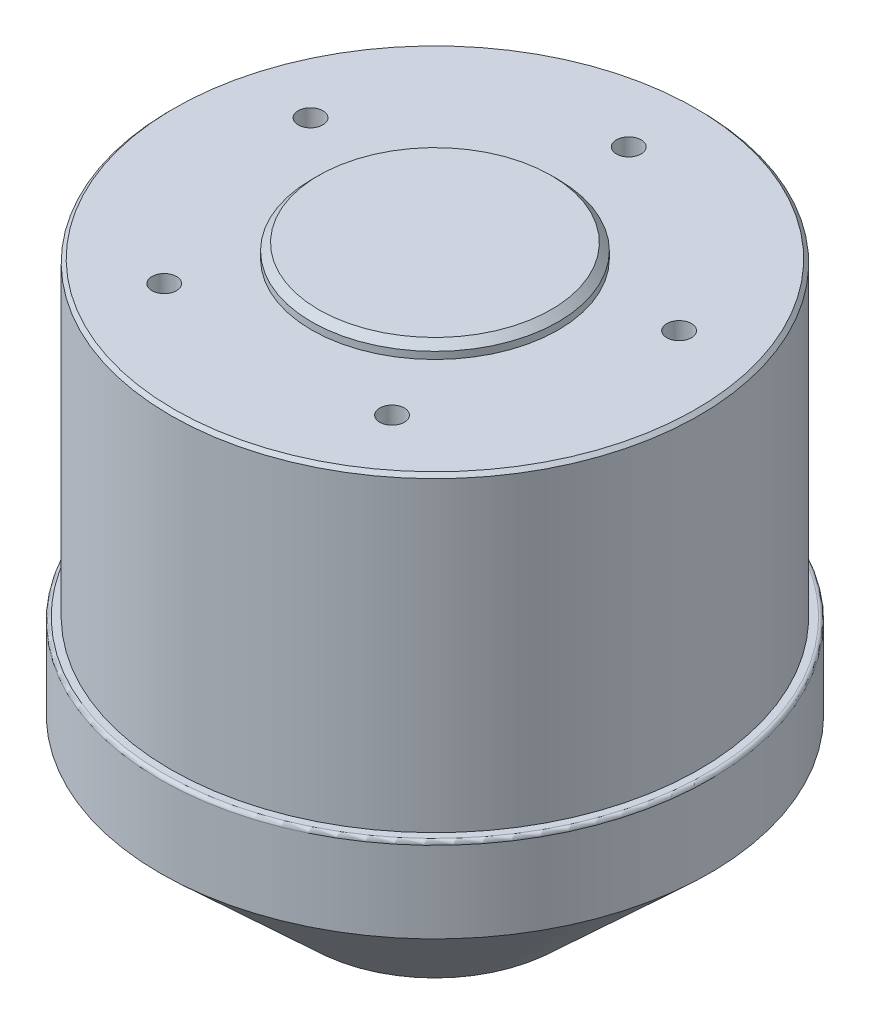
ISO-10303-21;
HEADER;
FILE_DESCRIPTION(('STEP AP214'),'2;1');
FILE_NAME('part.step','',(''),(''),'','','');
FILE_SCHEMA(('AUTOMOTIVE_DESIGN { 1 0 10303 214 1 1 1 1 }'));
ENDSEC;
DATA;
#1=APPLICATION_CONTEXT('core data for automotive mechanical design processes');
#2=APPLICATION_PROTOCOL_DEFINITION('international standard','automotive_design',2000,#1);
#3=PRODUCT_CONTEXT('',#1,'mechanical');
#4=PRODUCT('Part','Part','',(#3));
#5=PRODUCT_RELATED_PRODUCT_CATEGORY('part','',(#4));
#6=PRODUCT_DEFINITION_FORMATION('','',#4);
#7=PRODUCT_DEFINITION_CONTEXT('part definition',#1,'design');
#8=PRODUCT_DEFINITION('design','',#6,#7);
#9=PRODUCT_DEFINITION_SHAPE('','',#8);
#10=(LENGTH_UNIT() NAMED_UNIT(*) SI_UNIT(.MILLI.,.METRE.));
#11=(NAMED_UNIT(*) PLANE_ANGLE_UNIT() SI_UNIT($,.RADIAN.));
#12=(NAMED_UNIT(*) SI_UNIT($,.STERADIAN.) SOLID_ANGLE_UNIT());
#13=UNCERTAINTY_MEASURE_WITH_UNIT(LENGTH_MEASURE(1.E-05),#10,'distance_accuracy_value','');
#14=(GEOMETRIC_REPRESENTATION_CONTEXT(3) GLOBAL_UNCERTAINTY_ASSIGNED_CONTEXT((#13)) GLOBAL_UNIT_ASSIGNED_CONTEXT((#10,
#11,#12)) REPRESENTATION_CONTEXT('',''));
#15=CARTESIAN_POINT('',(0.,0.,0.));
#16=DIRECTION('',(0.,0.,1.));
#17=DIRECTION('',(1.,0.,0.));
#18=AXIS2_PLACEMENT_3D('',#15,#16,#17);
#19=CARTESIAN_POINT('',(0.,76.,0.));
#20=DIRECTION('',(0.,-1.,0.));
#21=DIRECTION('',(0.,0.,-1.));
#22=AXIS2_PLACEMENT_3D('',#19,#20,#21);
#23=CYLINDRICAL_SURFACE('',#22,37.5);
#24=CARTESIAN_POINT('',(0.,75.5,0.));
#25=DIRECTION('',(0.,1.,0.));
#26=DIRECTION('',(0.,0.,1.));
#27=AXIS2_PLACEMENT_3D('',#24,#25,#26);
#28=CIRCLE('',#27,37.5);
#29=CARTESIAN_POINT('',(0.,75.5,37.5));
#30=VERTEX_POINT('',#29);
#31=EDGE_CURVE('E78',#30,#30,#28,.F.);
#32=ORIENTED_EDGE('',*,*,#31,.T.);
#33=EDGE_LOOP('',(#32));
#34=FACE_BOUND('',#33,.T.);
#35=CARTESIAN_POINT('',(0.,32.,0.));
#36=DIRECTION('',(0.,1.,0.));
#37=DIRECTION('',(0.,0.,1.));
#38=AXIS2_PLACEMENT_3D('',#35,#36,#37);
#39=CIRCLE('',#38,37.5);
#40=CARTESIAN_POINT('',(0.,32.,37.5));
#41=VERTEX_POINT('',#40);
#42=EDGE_CURVE('E98',#41,#41,#39,.T.);
#43=ORIENTED_EDGE('',*,*,#42,.T.);
#44=EDGE_LOOP('',(#43));
#45=FACE_BOUND('',#44,.T.);
#46=ADVANCED_FACE('F53',(#34,#45),#23,.T.);
#47=CARTESIAN_POINT('',(0.,76.,0.));
#48=DIRECTION('',(0.,1.,0.));
#49=DIRECTION('',(0.,0.,1.));
#50=AXIS2_PLACEMENT_3D('',#47,#48,#49);
#51=PLANE('',#50);
#52=CARTESIAN_POINT('',(0.,76.,0.));
#53=DIRECTION('',(0.,1.,0.));
#54=DIRECTION('',(0.,0.,1.));
#55=AXIS2_PLACEMENT_3D('',#52,#53,#54);
#56=CIRCLE('',#55,37.);
#57=CARTESIAN_POINT('',(0.,76.,37.));
#58=VERTEX_POINT('',#57);
#59=EDGE_CURVE('E82',#58,#58,#56,.T.);
#60=ORIENTED_EDGE('',*,*,#59,.T.);
#61=EDGE_LOOP('',(#60));
#62=FACE_BOUND('',#61,.T.);
#63=CARTESIAN_POINT('',(0.,76.,-27.5));
#64=DIRECTION('',(0.,1.,0.));
#65=DIRECTION('',(0.,0.,1.));
#66=AXIS2_PLACEMENT_3D('',#63,#64,#65);
#67=CIRCLE('',#66,1.75);
#68=CARTESIAN_POINT('',(0.,76.,-25.75));
#69=VERTEX_POINT('',#68);
#70=EDGE_CURVE('E136',#69,#69,#67,.T.);
#71=ORIENTED_EDGE('',*,*,#70,.F.);
#72=EDGE_LOOP('',(#71));
#73=FACE_BOUND('',#72,.T.);
#74=CARTESIAN_POINT('',(26.1540541981167,76.,-8.49796734531098));
#75=DIRECTION('',(0.,1.,0.));
#76=DIRECTION('',(0.,0.,1.));
#77=AXIS2_PLACEMENT_3D('',#74,#75,#76);
#78=CIRCLE('',#77,1.75);
#79=CARTESIAN_POINT('',(26.1540541981167,76.,-6.74796734531098));
#80=VERTEX_POINT('',#79);
#81=EDGE_CURVE('E132',#80,#80,#78,.T.);
#82=ORIENTED_EDGE('',*,*,#81,.F.);
#83=EDGE_LOOP('',(#82));
#84=FACE_BOUND('',#83,.T.);
#85=CARTESIAN_POINT('',(16.1640944380429,76.,22.2479673453112));
#86=DIRECTION('',(0.,1.,0.));
#87=DIRECTION('',(0.,0.,1.));
#88=AXIS2_PLACEMENT_3D('',#85,#86,#87);
#89=CIRCLE('',#88,1.75);
#90=CARTESIAN_POINT('',(16.1640944380429,76.,23.9979673453112));
#91=VERTEX_POINT('',#90);
#92=EDGE_CURVE('E124',#91,#91,#89,.T.);
#93=ORIENTED_EDGE('',*,*,#92,.F.);
#94=EDGE_LOOP('',(#93));
#95=FACE_BOUND('',#94,.T.);
#96=CARTESIAN_POINT('',(-16.1640944380432,76.,22.2479673453109));
#97=DIRECTION('',(0.,1.,0.));
#98=DIRECTION('',(0.,0.,1.));
#99=AXIS2_PLACEMENT_3D('',#96,#97,#98);
#100=CIRCLE('',#99,1.75);
#101=CARTESIAN_POINT('',(-16.1640944380432,76.,23.9979673453109));
#102=VERTEX_POINT('',#101);
#103=EDGE_CURVE('E116',#102,#102,#100,.T.);
#104=ORIENTED_EDGE('',*,*,#103,.F.);
#105=EDGE_LOOP('',(#104));
#106=FACE_BOUND('',#105,.T.);
#107=CARTESIAN_POINT('',(-26.1540541981166,76.,-8.49796734531135));
#108=DIRECTION('',(0.,1.,0.));
#109=DIRECTION('',(0.,0.,1.));
#110=AXIS2_PLACEMENT_3D('',#107,#108,#109);
#111=CIRCLE('',#110,1.75);
#112=CARTESIAN_POINT('',(-26.1540541981166,76.,-6.74796734531135));
#113=VERTEX_POINT('',#112);
#114=EDGE_CURVE('E107',#113,#113,#111,.T.);
#115=ORIENTED_EDGE('',*,*,#114,.F.);
#116=EDGE_LOOP('',(#115));
#117=FACE_BOUND('',#116,.T.);
#118=CARTESIAN_POINT('',(0.,76.,0.));
#119=DIRECTION('',(0.,1.,0.));
#120=DIRECTION('',(0.,0.,1.));
#121=AXIS2_PLACEMENT_3D('',#118,#119,#120);
#122=CIRCLE('',#121,17.5);
#123=CARTESIAN_POINT('',(0.,76.,17.5));
#124=VERTEX_POINT('',#123);
#125=EDGE_CURVE('E94',#124,#124,#122,.T.);
#126=ORIENTED_EDGE('',*,*,#125,.F.);
#127=EDGE_LOOP('',(#126));
#128=FACE_BOUND('',#127,.T.);
#129=ADVANCED_FACE('F188',(#62,#73,#84,#95,#106,#117,#128),#51,.T.);
#130=CARTESIAN_POINT('',(0.,78.,0.));
#131=DIRECTION('',(0.,-1.,0.));
#132=DIRECTION('',(0.,0.,-1.));
#133=AXIS2_PLACEMENT_3D('',#130,#131,#132);
#134=CYLINDRICAL_SURFACE('',#133,17.5);
#135=CARTESIAN_POINT('',(0.,77.,0.));
#136=DIRECTION('',(0.,1.,0.));
#137=DIRECTION('',(0.,0.,1.));
#138=AXIS2_PLACEMENT_3D('',#135,#136,#137);
#139=CIRCLE('',#138,17.5);
#140=CARTESIAN_POINT('',(0.,77.,17.5));
#141=VERTEX_POINT('',#140);
#142=EDGE_CURVE('E11',#141,#141,#139,.F.);
#143=ORIENTED_EDGE('',*,*,#142,.T.);
#144=EDGE_LOOP('',(#143));
#145=FACE_BOUND('',#144,.T.);
#146=ORIENTED_EDGE('',*,*,#125,.T.);
#147=EDGE_LOOP('',(#146));
#148=FACE_BOUND('',#147,.T.);
#149=ADVANCED_FACE('F194',(#145,#148),#134,.T.);
#150=CARTESIAN_POINT('',(0.,78.,0.));
#151=DIRECTION('',(0.,1.,0.));
#152=DIRECTION('',(0.,0.,1.));
#153=AXIS2_PLACEMENT_3D('',#150,#151,#152);
#154=PLANE('',#153);
#155=CARTESIAN_POINT('',(0.,78.,0.));
#156=DIRECTION('',(0.,1.,0.));
#157=DIRECTION('',(0.,0.,1.));
#158=AXIS2_PLACEMENT_3D('',#155,#156,#157);
#159=CIRCLE('',#158,16.5);
#160=CARTESIAN_POINT('',(0.,78.,16.5));
#161=VERTEX_POINT('',#160);
#162=EDGE_CURVE('E62',#161,#161,#159,.T.);
#163=ORIENTED_EDGE('',*,*,#162,.T.);
#164=EDGE_LOOP('',(#163));
#165=FACE_BOUND('',#164,.T.);
#166=ADVANCED_FACE('F171',(#165),#154,.T.);
#167=CARTESIAN_POINT('',(0.,32.,0.));
#168=DIRECTION('',(0.,-1.,0.));
#169=DIRECTION('',(0.,0.,-1.));
#170=AXIS2_PLACEMENT_3D('',#167,#168,#169);
#171=CYLINDRICAL_SURFACE('',#170,39.);
#172=CARTESIAN_POINT('',(0.,20.0000000000001,0.));
#173=DIRECTION('',(0.,1.,0.));
#174=DIRECTION('',(0.,0.,1.));
#175=AXIS2_PLACEMENT_3D('',#172,#173,#174);
#176=CIRCLE('',#175,39.);
#177=CARTESIAN_POINT('',(0.,20.0000000000001,39.));
#178=VERTEX_POINT('',#177);
#179=EDGE_CURVE('E72',#178,#178,#176,.T.);
#180=ORIENTED_EDGE('',*,*,#179,.T.);
#181=EDGE_LOOP('',(#180));
#182=FACE_BOUND('',#181,.T.);
#183=CARTESIAN_POINT('',(0.,31.5,0.));
#184=DIRECTION('',(0.,1.,0.));
#185=DIRECTION('',(0.,0.,1.));
#186=AXIS2_PLACEMENT_3D('',#183,#184,#185);
#187=CIRCLE('',#186,39.);
#188=CARTESIAN_POINT('',(0.,31.5,39.));
#189=VERTEX_POINT('',#188);
#190=EDGE_CURVE('E86',#189,#189,#187,.F.);
#191=ORIENTED_EDGE('',*,*,#190,.T.);
#192=EDGE_LOOP('',(#191));
#193=FACE_BOUND('',#192,.T.);
#194=ADVANCED_FACE('F168',(#182,#193),#171,.T.);
#195=CARTESIAN_POINT('',(0.,32.,0.));
#196=DIRECTION('',(0.,1.,0.));
#197=DIRECTION('',(0.,0.,1.));
#198=AXIS2_PLACEMENT_3D('',#195,#196,#197);
#199=PLANE('',#198);
#200=CARTESIAN_POINT('',(0.,32.,0.));
#201=DIRECTION('',(0.,1.,0.));
#202=DIRECTION('',(0.,0.,1.));
#203=AXIS2_PLACEMENT_3D('',#200,#201,#202);
#204=CIRCLE('',#203,38.5);
#205=CARTESIAN_POINT('',(0.,32.,38.5));
#206=VERTEX_POINT('',#205);
#207=EDGE_CURVE('E90',#206,#206,#204,.T.);
#208=ORIENTED_EDGE('',*,*,#207,.T.);
#209=EDGE_LOOP('',(#208));
#210=FACE_BOUND('',#209,.T.);
#211=ORIENTED_EDGE('',*,*,#42,.F.);
#212=EDGE_LOOP('',(#211));
#213=FACE_BOUND('',#212,.T.);
#214=ADVANCED_FACE('F158',(#210,#213),#199,.T.);
#215=CARTESIAN_POINT('',(0.,0.,0.));
#216=DIRECTION('',(0.,1.,0.));
#217=DIRECTION('',(0.,0.,1.));
#218=AXIS2_PLACEMENT_3D('',#215,#216,#217);
#219=PLANE('',#218);
#220=CARTESIAN_POINT('',(0.,0.,0.));
#221=DIRECTION('',(0.,-1.,0.));
#222=DIRECTION('',(0.,0.,-1.));
#223=AXIS2_PLACEMENT_3D('',#220,#221,#222);
#224=CIRCLE('',#223,4.);
#225=CARTESIAN_POINT('',(0.,0.,-4.));
#226=VERTEX_POINT('',#225);
#227=EDGE_CURVE('E146',#226,#226,#224,.T.);
#228=ORIENTED_EDGE('',*,*,#227,.F.);
#229=EDGE_LOOP('',(#228));
#230=FACE_BOUND('',#229,.T.);
#231=CARTESIAN_POINT('',(0.,0.,0.));
#232=DIRECTION('',(0.,1.,0.));
#233=DIRECTION('',(0.,0.,1.));
#234=AXIS2_PLACEMENT_3D('',#231,#232,#233);
#235=CIRCLE('',#234,17.4999999999999);
#236=CARTESIAN_POINT('',(0.,0.,17.4999999999999));
#237=VERTEX_POINT('',#236);
#238=EDGE_CURVE('E67',#237,#237,#235,.F.);
#239=ORIENTED_EDGE('',*,*,#238,.T.);
#240=EDGE_LOOP('',(#239));
#241=FACE_BOUND('',#240,.T.);
#242=ADVANCED_FACE('F154',(#230,#241),#219,.F.);
#243=CARTESIAN_POINT('',(-26.1540541981166,69.,-8.49796734531135));
#244=DIRECTION('',(0.,1.,0.));
#245=DIRECTION('',(0.,0.,1.));
#246=AXIS2_PLACEMENT_3D('',#243,#244,#245);
#247=CYLINDRICAL_SURFACE('',#246,1.75);
#248=CARTESIAN_POINT('',(-26.1540541981166,69.,-8.49796734531135));
#249=DIRECTION('',(0.,1.,0.));
#250=DIRECTION('',(0.,0.,1.));
#251=AXIS2_PLACEMENT_3D('',#248,#249,#250);
#252=CIRCLE('',#251,1.75);
#253=CARTESIAN_POINT('',(-26.1540541981166,69.,-6.74796734531135));
#254=VERTEX_POINT('',#253);
#255=EDGE_CURVE('E103',#254,#254,#252,.T.);
#256=ORIENTED_EDGE('',*,*,#255,.F.);
#257=EDGE_LOOP('',(#256));
#258=FACE_BOUND('',#257,.T.);
#259=ORIENTED_EDGE('',*,*,#114,.T.);
#260=EDGE_LOOP('',(#259));
#261=FACE_BOUND('',#260,.T.);
#262=ADVANCED_FACE('F157',(#258,#261),#247,.F.);
#263=CARTESIAN_POINT('',(-26.1540541981166,69.,-8.49796734531135));
#264=DIRECTION('',(0.,1.,0.));
#265=DIRECTION('',(0.,0.,1.));
#266=AXIS2_PLACEMENT_3D('',#263,#264,#265);
#267=PLANE('',#266);
#268=ORIENTED_EDGE('',*,*,#255,.T.);
#269=EDGE_LOOP('',(#268));
#270=FACE_BOUND('',#269,.T.);
#271=ADVANCED_FACE('F233',(#270),#267,.T.);
#272=CARTESIAN_POINT('',(-16.1640944380432,69.,22.2479673453109));
#273=DIRECTION('',(0.,1.,0.));
#274=DIRECTION('',(0.,0.,1.));
#275=AXIS2_PLACEMENT_3D('',#272,#273,#274);
#276=CYLINDRICAL_SURFACE('',#275,1.75);
#277=CARTESIAN_POINT('',(-16.1640944380432,69.,22.2479673453109));
#278=DIRECTION('',(0.,1.,0.));
#279=DIRECTION('',(0.,0.,1.));
#280=AXIS2_PLACEMENT_3D('',#277,#278,#279);
#281=CIRCLE('',#280,1.75);
#282=CARTESIAN_POINT('',(-16.1640944380432,69.,23.9979673453109));
#283=VERTEX_POINT('',#282);
#284=EDGE_CURVE('E112',#283,#283,#281,.T.);
#285=ORIENTED_EDGE('',*,*,#284,.F.);
#286=EDGE_LOOP('',(#285));
#287=FACE_BOUND('',#286,.T.);
#288=ORIENTED_EDGE('',*,*,#103,.T.);
#289=EDGE_LOOP('',(#288));
#290=FACE_BOUND('',#289,.T.);
#291=ADVANCED_FACE('F236',(#287,#290),#276,.F.);
#292=CARTESIAN_POINT('',(-16.1640944380432,69.,22.2479673453109));
#293=DIRECTION('',(0.,1.,0.));
#294=DIRECTION('',(0.,0.,1.));
#295=AXIS2_PLACEMENT_3D('',#292,#293,#294);
#296=PLANE('',#295);
#297=ORIENTED_EDGE('',*,*,#284,.T.);
#298=EDGE_LOOP('',(#297));
#299=FACE_BOUND('',#298,.T.);
#300=ADVANCED_FACE('F241',(#299),#296,.T.);
#301=CARTESIAN_POINT('',(16.1640944380429,69.,22.2479673453112));
#302=DIRECTION('',(0.,1.,0.));
#303=DIRECTION('',(0.,0.,1.));
#304=AXIS2_PLACEMENT_3D('',#301,#302,#303);
#305=CYLINDRICAL_SURFACE('',#304,1.75);
#306=CARTESIAN_POINT('',(16.1640944380429,69.,22.2479673453112));
#307=DIRECTION('',(0.,1.,0.));
#308=DIRECTION('',(0.,0.,1.));
#309=AXIS2_PLACEMENT_3D('',#306,#307,#308);
#310=CIRCLE('',#309,1.75);
#311=CARTESIAN_POINT('',(16.1640944380429,69.,23.9979673453112));
#312=VERTEX_POINT('',#311);
#313=EDGE_CURVE('E120',#312,#312,#310,.T.);
#314=ORIENTED_EDGE('',*,*,#313,.F.);
#315=EDGE_LOOP('',(#314));
#316=FACE_BOUND('',#315,.T.);
#317=ORIENTED_EDGE('',*,*,#92,.T.);
#318=EDGE_LOOP('',(#317));
#319=FACE_BOUND('',#318,.T.);
#320=ADVANCED_FACE('F244',(#316,#319),#305,.F.);
#321=CARTESIAN_POINT('',(16.1640944380429,69.,22.2479673453112));
#322=DIRECTION('',(0.,1.,0.));
#323=DIRECTION('',(0.,0.,1.));
#324=AXIS2_PLACEMENT_3D('',#321,#322,#323);
#325=PLANE('',#324);
#326=ORIENTED_EDGE('',*,*,#313,.T.);
#327=EDGE_LOOP('',(#326));
#328=FACE_BOUND('',#327,.T.);
#329=ADVANCED_FACE('F249',(#328),#325,.T.);
#330=CARTESIAN_POINT('',(26.1540541981167,69.,-8.49796734531098));
#331=DIRECTION('',(0.,1.,0.));
#332=DIRECTION('',(0.,0.,1.));
#333=AXIS2_PLACEMENT_3D('',#330,#331,#332);
#334=CYLINDRICAL_SURFACE('',#333,1.75);
#335=CARTESIAN_POINT('',(26.1540541981167,69.,-8.49796734531098));
#336=DIRECTION('',(0.,1.,0.));
#337=DIRECTION('',(0.,0.,1.));
#338=AXIS2_PLACEMENT_3D('',#335,#336,#337);
#339=CIRCLE('',#338,1.75);
#340=CARTESIAN_POINT('',(26.1540541981167,69.,-6.74796734531098));
#341=VERTEX_POINT('',#340);
#342=EDGE_CURVE('E128',#341,#341,#339,.T.);
#343=ORIENTED_EDGE('',*,*,#342,.F.);
#344=EDGE_LOOP('',(#343));
#345=FACE_BOUND('',#344,.T.);
#346=ORIENTED_EDGE('',*,*,#81,.T.);
#347=EDGE_LOOP('',(#346));
#348=FACE_BOUND('',#347,.T.);
#349=ADVANCED_FACE('F252',(#345,#348),#334,.F.);
#350=CARTESIAN_POINT('',(26.1540541981167,69.,-8.49796734531098));
#351=DIRECTION('',(0.,1.,0.));
#352=DIRECTION('',(0.,0.,1.));
#353=AXIS2_PLACEMENT_3D('',#350,#351,#352);
#354=PLANE('',#353);
#355=ORIENTED_EDGE('',*,*,#342,.T.);
#356=EDGE_LOOP('',(#355));
#357=FACE_BOUND('',#356,.T.);
#358=ADVANCED_FACE('F257',(#357),#354,.T.);
#359=CARTESIAN_POINT('',(0.,69.,-27.5));
#360=DIRECTION('',(0.,1.,0.));
#361=DIRECTION('',(0.,0.,1.));
#362=AXIS2_PLACEMENT_3D('',#359,#360,#361);
#363=CYLINDRICAL_SURFACE('',#362,1.75);
#364=CARTESIAN_POINT('',(0.,69.,-27.5));
#365=DIRECTION('',(0.,1.,0.));
#366=DIRECTION('',(0.,0.,1.));
#367=AXIS2_PLACEMENT_3D('',#364,#365,#366);
#368=CIRCLE('',#367,1.75);
#369=CARTESIAN_POINT('',(0.,69.,-25.75));
#370=VERTEX_POINT('',#369);
#371=EDGE_CURVE('E102',#370,#370,#368,.T.);
#372=ORIENTED_EDGE('',*,*,#371,.F.);
#373=EDGE_LOOP('',(#372));
#374=FACE_BOUND('',#373,.T.);
#375=ORIENTED_EDGE('',*,*,#70,.T.);
#376=EDGE_LOOP('',(#375));
#377=FACE_BOUND('',#376,.T.);
#378=ADVANCED_FACE('F260',(#374,#377),#363,.F.);
#379=CARTESIAN_POINT('',(0.,69.,-27.5));
#380=DIRECTION('',(0.,1.,0.));
#381=DIRECTION('',(0.,0.,1.));
#382=AXIS2_PLACEMENT_3D('',#379,#380,#381);
#383=PLANE('',#382);
#384=ORIENTED_EDGE('',*,*,#371,.T.);
#385=EDGE_LOOP('',(#384));
#386=FACE_BOUND('',#385,.T.);
#387=ADVANCED_FACE('F178',(#386),#383,.T.);
#388=CARTESIAN_POINT('',(0.,31.5,0.));
#389=DIRECTION('',(0.,1.,0.));
#390=DIRECTION('',(0.,0.,1.));
#391=AXIS2_PLACEMENT_3D('',#388,#389,#390);
#392=TOROIDAL_SURFACE('',#391,38.5,0.5);
#393=ORIENTED_EDGE('',*,*,#190,.F.);
#394=EDGE_LOOP('',(#393));
#395=FACE_BOUND('',#394,.T.);
#396=ORIENTED_EDGE('',*,*,#207,.F.);
#397=EDGE_LOOP('',(#396));
#398=FACE_BOUND('',#397,.T.);
#399=ADVANCED_FACE('F175',(#395,#398),#392,.T.);
#400=CARTESIAN_POINT('',(0.,76.,0.));
#401=DIRECTION('',(0.,-1.,0.));
#402=DIRECTION('',(0.,0.,-1.));
#403=AXIS2_PLACEMENT_3D('',#400,#401,#402);
#404=CONICAL_SURFACE('',#403,37.,0.785398163397448);
#405=ORIENTED_EDGE('',*,*,#31,.F.);
#406=EDGE_LOOP('',(#405));
#407=FACE_BOUND('',#406,.T.);
#408=ORIENTED_EDGE('',*,*,#59,.F.);
#409=EDGE_LOOP('',(#408));
#410=FACE_BOUND('',#409,.T.);
#411=ADVANCED_FACE('F165',(#407,#410),#404,.T.);
#412=CARTESIAN_POINT('',(0.,20.0000000000001,0.));
#413=DIRECTION('',(0.,1.,0.));
#414=DIRECTION('',(0.,0.,1.));
#415=AXIS2_PLACEMENT_3D('',#412,#413,#414);
#416=CONICAL_SURFACE('',#415,39.,0.821527013910224);
#417=ORIENTED_EDGE('',*,*,#238,.F.);
#418=EDGE_LOOP('',(#417));
#419=FACE_BOUND('',#418,.T.);
#420=ORIENTED_EDGE('',*,*,#179,.F.);
#421=EDGE_LOOP('',(#420));
#422=FACE_BOUND('',#421,.T.);
#423=ADVANCED_FACE('F162',(#419,#422),#416,.T.);
#424=CARTESIAN_POINT('',(0.,78.,0.));
#425=DIRECTION('',(0.,-1.,0.));
#426=DIRECTION('',(0.,0.,-1.));
#427=AXIS2_PLACEMENT_3D('',#424,#425,#426);
#428=CONICAL_SURFACE('',#427,16.5,0.785398163397443);
#429=ORIENTED_EDGE('',*,*,#142,.F.);
#430=EDGE_LOOP('',(#429));
#431=FACE_BOUND('',#430,.T.);
#432=ORIENTED_EDGE('',*,*,#162,.F.);
#433=EDGE_LOOP('',(#432));
#434=FACE_BOUND('',#433,.T.);
#435=ADVANCED_FACE('F56',(#431,#434),#428,.T.);
#436=CARTESIAN_POINT('',(0.,68.,0.));
#437=DIRECTION('',(0.,1.,0.));
#438=DIRECTION('',(0.,0.,1.));
#439=AXIS2_PLACEMENT_3D('',#436,#437,#438);
#440=PLANE('',#439);
#441=CARTESIAN_POINT('',(0.,68.,0.));
#442=DIRECTION('',(0.,1.,0.));
#443=DIRECTION('',(0.,0.,1.));
#444=AXIS2_PLACEMENT_3D('',#441,#442,#443);
#445=CIRCLE('',#444,4.);
#446=CARTESIAN_POINT('',(0.,68.,4.));
#447=VERTEX_POINT('',#446);
#448=EDGE_CURVE('E108',#447,#447,#445,.F.);
#449=ORIENTED_EDGE('',*,*,#448,.T.);
#450=EDGE_LOOP('',(#449));
#451=FACE_BOUND('',#450,.T.);
#452=ADVANCED_FACE('F271',(#451),#440,.F.);
#453=CARTESIAN_POINT('',(0.,89.3137084989848,0.));
#454=DIRECTION('',(0.,-1.,0.));
#455=DIRECTION('',(0.,0.,-1.));
#456=AXIS2_PLACEMENT_3D('',#453,#454,#455);
#457=CYLINDRICAL_SURFACE('',#456,4.);
#458=ORIENTED_EDGE('',*,*,#227,.T.);
#459=EDGE_LOOP('',(#458));
#460=FACE_BOUND('',#459,.T.);
#461=ORIENTED_EDGE('',*,*,#448,.F.);
#462=EDGE_LOOP('',(#461));
#463=FACE_BOUND('',#462,.T.);
#464=ADVANCED_FACE('F151',(#460,#463),#457,.F.);
#465=CLOSED_SHELL('',(#46,#129,#149,#166,#194,#214,#242,#262,#271,#291,#300,#320,#329,#349,#358,
#378,#387,#399,#411,#423,#435,#452,#464));
#466=MANIFOLD_SOLID_BREP('B2',#465);
#467=ADVANCED_BREP_SHAPE_REPRESENTATION('',(#18,#466),#14);
#468=SHAPE_DEFINITION_REPRESENTATION(#9,#467);
ENDSEC;
END-ISO-10303-21;
